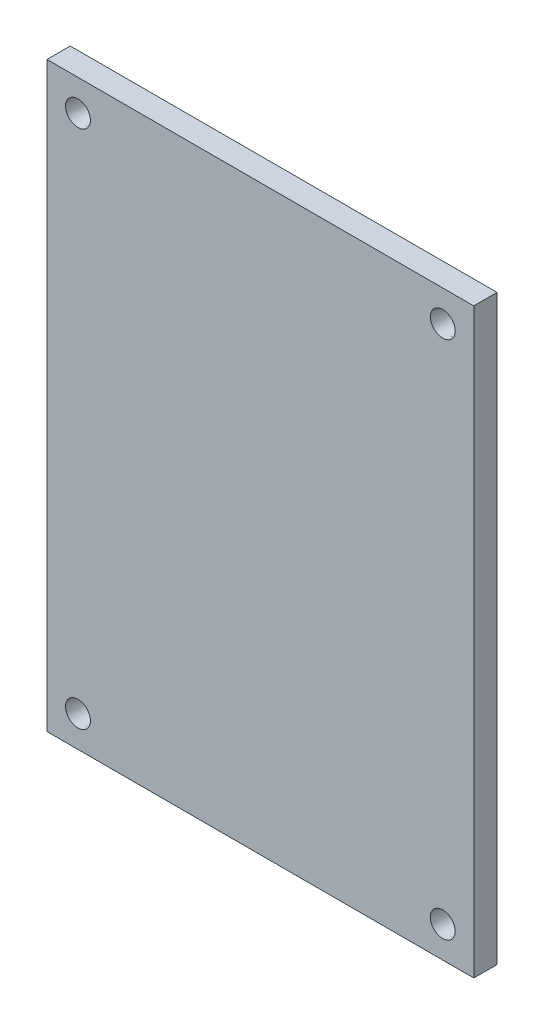
ISO-10303-21;
HEADER;
FILE_DESCRIPTION(('STEP AP214'),'2;1');
FILE_NAME('part.step','',(''),(''),'','','');
FILE_SCHEMA(('AUTOMOTIVE_DESIGN { 1 0 10303 214 1 1 1 1 }'));
ENDSEC;
DATA;
#1=APPLICATION_CONTEXT('core data for automotive mechanical design processes');
#2=APPLICATION_PROTOCOL_DEFINITION('international standard','automotive_design',2000,#1);
#3=PRODUCT_CONTEXT('',#1,'mechanical');
#4=PRODUCT('Part','Part','',(#3));
#5=PRODUCT_RELATED_PRODUCT_CATEGORY('part','',(#4));
#6=PRODUCT_DEFINITION_FORMATION('','',#4);
#7=PRODUCT_DEFINITION_CONTEXT('part definition',#1,'design');
#8=PRODUCT_DEFINITION('design','',#6,#7);
#9=PRODUCT_DEFINITION_SHAPE('','',#8);
#10=(LENGTH_UNIT() NAMED_UNIT(*) SI_UNIT(.MILLI.,.METRE.));
#11=(NAMED_UNIT(*) PLANE_ANGLE_UNIT() SI_UNIT($,.RADIAN.));
#12=(NAMED_UNIT(*) SI_UNIT($,.STERADIAN.) SOLID_ANGLE_UNIT());
#13=UNCERTAINTY_MEASURE_WITH_UNIT(LENGTH_MEASURE(1.E-05),#10,'distance_accuracy_value','');
#14=(GEOMETRIC_REPRESENTATION_CONTEXT(3) GLOBAL_UNCERTAINTY_ASSIGNED_CONTEXT((#13)) GLOBAL_UNIT_ASSIGNED_CONTEXT((#10,
#11,#12)) REPRESENTATION_CONTEXT('',''));
#15=CARTESIAN_POINT('',(0.,0.,0.));
#16=DIRECTION('',(0.,0.,1.));
#17=DIRECTION('',(1.,0.,0.));
#18=AXIS2_PLACEMENT_3D('',#15,#16,#17);
#19=CARTESIAN_POINT('',(27.5,-37.5,3.));
#20=DIRECTION('',(0.,1.,0.));
#21=DIRECTION('',(0.,0.,1.));
#22=AXIS2_PLACEMENT_3D('',#19,#20,#21);
#23=PLANE('',#22);
#24=DIRECTION('',(1.,0.,0.));
#25=VECTOR('',#24,1.);
#26=CARTESIAN_POINT('',(27.5,-37.5,0.));
#27=LINE('',#26,#25);
#28=CARTESIAN_POINT('',(-27.5,-37.5,0.));
#29=VERTEX_POINT('',#28);
#30=CARTESIAN_POINT('',(27.5,-37.5,0.));
#31=VERTEX_POINT('',#30);
#32=EDGE_CURVE('E106',#29,#31,#27,.T.);
#33=ORIENTED_EDGE('',*,*,#32,.T.);
#34=DIRECTION('',(0.,0.,-1.));
#35=VECTOR('',#34,1.);
#36=CARTESIAN_POINT('',(27.5,-37.5,3.));
#37=LINE('',#36,#35);
#38=CARTESIAN_POINT('',(27.5,-37.5,3.));
#39=VERTEX_POINT('',#38);
#40=EDGE_CURVE('E11',#39,#31,#37,.T.);
#41=ORIENTED_EDGE('',*,*,#40,.F.);
#42=DIRECTION('',(1.,0.,0.));
#43=VECTOR('',#42,1.);
#44=CARTESIAN_POINT('',(27.5,-37.5,3.));
#45=LINE('',#44,#43);
#46=CARTESIAN_POINT('',(-27.5,-37.5,3.));
#47=VERTEX_POINT('',#46);
#48=EDGE_CURVE('E94',#47,#39,#45,.T.);
#49=ORIENTED_EDGE('',*,*,#48,.F.);
#50=DIRECTION('',(0.,0.,-1.));
#51=VECTOR('',#50,1.);
#52=CARTESIAN_POINT('',(-27.5,-37.5,3.));
#53=LINE('',#52,#51);
#54=EDGE_CURVE('E105',#47,#29,#53,.T.);
#55=ORIENTED_EDGE('',*,*,#54,.T.);
#56=EDGE_LOOP('',(#33,#41,#49,#55));
#57=FACE_BOUND('',#56,.T.);
#58=ADVANCED_FACE('F43',(#57),#23,.F.);
#59=CARTESIAN_POINT('',(27.5,37.5,3.));
#60=DIRECTION('',(-1.,0.,0.));
#61=DIRECTION('',(0.,-1.,0.));
#62=AXIS2_PLACEMENT_3D('',#59,#60,#61);
#63=PLANE('',#62);
#64=DIRECTION('',(0.,1.,0.));
#65=VECTOR('',#64,1.);
#66=CARTESIAN_POINT('',(27.5,37.5,0.));
#67=LINE('',#66,#65);
#68=CARTESIAN_POINT('',(27.5,37.5,0.));
#69=VERTEX_POINT('',#68);
#70=EDGE_CURVE('E98',#31,#69,#67,.T.);
#71=ORIENTED_EDGE('',*,*,#70,.T.);
#72=DIRECTION('',(0.,0.,-1.));
#73=VECTOR('',#72,1.);
#74=CARTESIAN_POINT('',(27.5,37.5,3.));
#75=LINE('',#74,#73);
#76=CARTESIAN_POINT('',(27.5,37.5,3.));
#77=VERTEX_POINT('',#76);
#78=EDGE_CURVE('E51',#77,#69,#75,.T.);
#79=ORIENTED_EDGE('',*,*,#78,.F.);
#80=DIRECTION('',(0.,1.,0.));
#81=VECTOR('',#80,1.);
#82=CARTESIAN_POINT('',(27.5,37.5,3.));
#83=LINE('',#82,#81);
#84=EDGE_CURVE('E90',#39,#77,#83,.T.);
#85=ORIENTED_EDGE('',*,*,#84,.F.);
#86=ORIENTED_EDGE('',*,*,#40,.T.);
#87=EDGE_LOOP('',(#71,#79,#85,#86));
#88=FACE_BOUND('',#87,.T.);
#89=ADVANCED_FACE('F100',(#88),#63,.F.);
#90=CARTESIAN_POINT('',(27.5,37.5,3.));
#91=DIRECTION('',(0.,-1.,0.));
#92=DIRECTION('',(0.,0.,-1.));
#93=AXIS2_PLACEMENT_3D('',#90,#91,#92);
#94=PLANE('',#93);
#95=DIRECTION('',(-1.,0.,0.));
#96=VECTOR('',#95,1.);
#97=CARTESIAN_POINT('',(27.5,37.5,0.));
#98=LINE('',#97,#96);
#99=CARTESIAN_POINT('',(-27.5,37.5,0.));
#100=VERTEX_POINT('',#99);
#101=EDGE_CURVE('E77',#69,#100,#98,.T.);
#102=ORIENTED_EDGE('',*,*,#101,.T.);
#103=DIRECTION('',(0.,0.,-1.));
#104=VECTOR('',#103,1.);
#105=CARTESIAN_POINT('',(-27.5,37.5,3.));
#106=LINE('',#105,#104);
#107=CARTESIAN_POINT('',(-27.5,37.5,3.));
#108=VERTEX_POINT('',#107);
#109=EDGE_CURVE('E97',#108,#100,#106,.T.);
#110=ORIENTED_EDGE('',*,*,#109,.F.);
#111=DIRECTION('',(-1.,0.,0.));
#112=VECTOR('',#111,1.);
#113=CARTESIAN_POINT('',(27.5,37.5,3.));
#114=LINE('',#113,#112);
#115=EDGE_CURVE('E95',#77,#108,#114,.T.);
#116=ORIENTED_EDGE('',*,*,#115,.F.);
#117=ORIENTED_EDGE('',*,*,#78,.T.);
#118=EDGE_LOOP('',(#102,#110,#116,#117));
#119=FACE_BOUND('',#118,.T.);
#120=ADVANCED_FACE('F99',(#119),#94,.F.);
#121=CARTESIAN_POINT('',(-27.5,37.5,3.));
#122=DIRECTION('',(1.,0.,0.));
#123=DIRECTION('',(0.,1.,0.));
#124=AXIS2_PLACEMENT_3D('',#121,#122,#123);
#125=PLANE('',#124);
#126=DIRECTION('',(0.,-1.,0.));
#127=VECTOR('',#126,1.);
#128=CARTESIAN_POINT('',(-27.5,37.5,0.));
#129=LINE('',#128,#127);
#130=EDGE_CURVE('E85',#100,#29,#129,.T.);
#131=ORIENTED_EDGE('',*,*,#130,.T.);
#132=ORIENTED_EDGE('',*,*,#54,.F.);
#133=DIRECTION('',(0.,-1.,0.));
#134=VECTOR('',#133,1.);
#135=CARTESIAN_POINT('',(-27.5,37.5,3.));
#136=LINE('',#135,#134);
#137=EDGE_CURVE('E56',#108,#47,#136,.T.);
#138=ORIENTED_EDGE('',*,*,#137,.F.);
#139=ORIENTED_EDGE('',*,*,#109,.T.);
#140=EDGE_LOOP('',(#131,#132,#138,#139));
#141=FACE_BOUND('',#140,.T.);
#142=ADVANCED_FACE('F111',(#141),#125,.F.);
#143=CARTESIAN_POINT('',(0.,0.,3.));
#144=DIRECTION('',(0.,0.,1.));
#145=DIRECTION('',(1.,0.,0.));
#146=AXIS2_PLACEMENT_3D('',#143,#144,#145);
#147=PLANE('',#146);
#148=CARTESIAN_POINT('',(23.5,33.5,3.));
#149=DIRECTION('',(0.,0.,1.));
#150=DIRECTION('',(1.,0.,0.));
#151=AXIS2_PLACEMENT_3D('',#148,#149,#150);
#152=CIRCLE('',#151,1.6);
#153=CARTESIAN_POINT('',(25.1,33.5,3.));
#154=VERTEX_POINT('',#153);
#155=EDGE_CURVE('E127',#154,#154,#152,.T.);
#156=ORIENTED_EDGE('',*,*,#155,.F.);
#157=EDGE_LOOP('',(#156));
#158=FACE_BOUND('',#157,.T.);
#159=CARTESIAN_POINT('',(-23.5,33.5,3.));
#160=DIRECTION('',(0.,0.,1.));
#161=DIRECTION('',(1.,0.,0.));
#162=AXIS2_PLACEMENT_3D('',#159,#160,#161);
#163=CIRCLE('',#162,1.6);
#164=CARTESIAN_POINT('',(-21.9,33.5,3.));
#165=VERTEX_POINT('',#164);
#166=EDGE_CURVE('E134',#165,#165,#163,.T.);
#167=ORIENTED_EDGE('',*,*,#166,.F.);
#168=EDGE_LOOP('',(#167));
#169=FACE_BOUND('',#168,.T.);
#170=CARTESIAN_POINT('',(-23.5,-33.5,3.));
#171=DIRECTION('',(0.,0.,1.));
#172=DIRECTION('',(1.,0.,0.));
#173=AXIS2_PLACEMENT_3D('',#170,#171,#172);
#174=CIRCLE('',#173,1.6);
#175=CARTESIAN_POINT('',(-21.9,-33.5,3.));
#176=VERTEX_POINT('',#175);
#177=EDGE_CURVE('E124',#176,#176,#174,.T.);
#178=ORIENTED_EDGE('',*,*,#177,.F.);
#179=EDGE_LOOP('',(#178));
#180=FACE_BOUND('',#179,.T.);
#181=CARTESIAN_POINT('',(23.5,-33.5,3.));
#182=DIRECTION('',(0.,0.,1.));
#183=DIRECTION('',(1.,0.,0.));
#184=AXIS2_PLACEMENT_3D('',#181,#182,#183);
#185=CIRCLE('',#184,1.6);
#186=CARTESIAN_POINT('',(25.1,-33.5,3.));
#187=VERTEX_POINT('',#186);
#188=EDGE_CURVE('E125',#187,#187,#185,.T.);
#189=ORIENTED_EDGE('',*,*,#188,.F.);
#190=EDGE_LOOP('',(#189));
#191=FACE_BOUND('',#190,.T.);
#192=ORIENTED_EDGE('',*,*,#48,.T.);
#193=ORIENTED_EDGE('',*,*,#84,.T.);
#194=ORIENTED_EDGE('',*,*,#115,.T.);
#195=ORIENTED_EDGE('',*,*,#137,.T.);
#196=EDGE_LOOP('',(#192,#193,#194,#195));
#197=FACE_BOUND('',#196,.T.);
#198=ADVANCED_FACE('F89',(#158,#169,#180,#191,#197),#147,.T.);
#199=CARTESIAN_POINT('',(0.,0.,0.));
#200=DIRECTION('',(0.,0.,1.));
#201=DIRECTION('',(1.,0.,0.));
#202=AXIS2_PLACEMENT_3D('',#199,#200,#201);
#203=PLANE('',#202);
#204=CARTESIAN_POINT('',(23.5,33.5,0.));
#205=DIRECTION('',(0.,0.,1.));
#206=DIRECTION('',(1.,0.,0.));
#207=AXIS2_PLACEMENT_3D('',#204,#205,#206);
#208=CIRCLE('',#207,1.33753400942223);
#209=CARTESIAN_POINT('',(24.8375340094222,33.5,0.));
#210=VERTEX_POINT('',#209);
#211=EDGE_CURVE('E128',#210,#210,#208,.T.);
#212=ORIENTED_EDGE('',*,*,#211,.T.);
#213=EDGE_LOOP('',(#212));
#214=FACE_BOUND('',#213,.T.);
#215=CARTESIAN_POINT('',(-23.5,33.5,0.));
#216=DIRECTION('',(0.,0.,1.));
#217=DIRECTION('',(1.,0.,0.));
#218=AXIS2_PLACEMENT_3D('',#215,#216,#217);
#219=CIRCLE('',#218,1.33753400942223);
#220=CARTESIAN_POINT('',(-22.1624659905778,33.5,0.));
#221=VERTEX_POINT('',#220);
#222=EDGE_CURVE('E129',#221,#221,#219,.T.);
#223=ORIENTED_EDGE('',*,*,#222,.T.);
#224=EDGE_LOOP('',(#223));
#225=FACE_BOUND('',#224,.T.);
#226=CARTESIAN_POINT('',(-23.5,-33.5,0.));
#227=DIRECTION('',(0.,0.,1.));
#228=DIRECTION('',(1.,0.,0.));
#229=AXIS2_PLACEMENT_3D('',#226,#227,#228);
#230=CIRCLE('',#229,1.33753400942223);
#231=CARTESIAN_POINT('',(-22.1624659905778,-33.5,0.));
#232=VERTEX_POINT('',#231);
#233=EDGE_CURVE('E136',#232,#232,#230,.T.);
#234=ORIENTED_EDGE('',*,*,#233,.T.);
#235=EDGE_LOOP('',(#234));
#236=FACE_BOUND('',#235,.T.);
#237=CARTESIAN_POINT('',(23.5,-33.5,0.));
#238=DIRECTION('',(0.,0.,1.));
#239=DIRECTION('',(1.,0.,0.));
#240=AXIS2_PLACEMENT_3D('',#237,#238,#239);
#241=CIRCLE('',#240,1.33753400942223);
#242=CARTESIAN_POINT('',(24.8375340094222,-33.5,0.));
#243=VERTEX_POINT('',#242);
#244=EDGE_CURVE('E108',#243,#243,#241,.T.);
#245=ORIENTED_EDGE('',*,*,#244,.T.);
#246=EDGE_LOOP('',(#245));
#247=FACE_BOUND('',#246,.T.);
#248=ORIENTED_EDGE('',*,*,#32,.F.);
#249=ORIENTED_EDGE('',*,*,#130,.F.);
#250=ORIENTED_EDGE('',*,*,#101,.F.);
#251=ORIENTED_EDGE('',*,*,#70,.F.);
#252=EDGE_LOOP('',(#248,#249,#250,#251));
#253=FACE_BOUND('',#252,.T.);
#254=ADVANCED_FACE('F120',(#214,#225,#236,#247,#253),#203,.F.);
#255=CARTESIAN_POINT('',(23.5,-33.5,3.));
#256=DIRECTION('',(0.,0.,1.));
#257=DIRECTION('',(1.,0.,0.));
#258=AXIS2_PLACEMENT_3D('',#255,#256,#257);
#259=CONICAL_SURFACE('',#258,1.6,0.0872664625997165);
#260=ORIENTED_EDGE('',*,*,#244,.F.);
#261=EDGE_LOOP('',(#260));
#262=FACE_BOUND('',#261,.T.);
#263=ORIENTED_EDGE('',*,*,#188,.T.);
#264=EDGE_LOOP('',(#263));
#265=FACE_BOUND('',#264,.T.);
#266=ADVANCED_FACE('F147',(#262,#265),#259,.F.);
#267=CARTESIAN_POINT('',(-23.5,-33.5,3.));
#268=DIRECTION('',(0.,0.,1.));
#269=DIRECTION('',(1.,0.,0.));
#270=AXIS2_PLACEMENT_3D('',#267,#268,#269);
#271=CONICAL_SURFACE('',#270,1.6,0.0872664625997165);
#272=ORIENTED_EDGE('',*,*,#233,.F.);
#273=EDGE_LOOP('',(#272));
#274=FACE_BOUND('',#273,.T.);
#275=ORIENTED_EDGE('',*,*,#177,.T.);
#276=EDGE_LOOP('',(#275));
#277=FACE_BOUND('',#276,.T.);
#278=ADVANCED_FACE('F148',(#274,#277),#271,.F.);
#279=CARTESIAN_POINT('',(-23.5,33.5,3.));
#280=DIRECTION('',(0.,0.,1.));
#281=DIRECTION('',(1.,0.,0.));
#282=AXIS2_PLACEMENT_3D('',#279,#280,#281);
#283=CONICAL_SURFACE('',#282,1.6,0.0872664625997165);
#284=ORIENTED_EDGE('',*,*,#222,.F.);
#285=EDGE_LOOP('',(#284));
#286=FACE_BOUND('',#285,.T.);
#287=ORIENTED_EDGE('',*,*,#166,.T.);
#288=EDGE_LOOP('',(#287));
#289=FACE_BOUND('',#288,.T.);
#290=ADVANCED_FACE('F149',(#286,#289),#283,.F.);
#291=CARTESIAN_POINT('',(23.5,33.5,3.));
#292=DIRECTION('',(0.,0.,1.));
#293=DIRECTION('',(1.,0.,0.));
#294=AXIS2_PLACEMENT_3D('',#291,#292,#293);
#295=CONICAL_SURFACE('',#294,1.6,0.0872664625997165);
#296=ORIENTED_EDGE('',*,*,#211,.F.);
#297=EDGE_LOOP('',(#296));
#298=FACE_BOUND('',#297,.T.);
#299=ORIENTED_EDGE('',*,*,#155,.T.);
#300=EDGE_LOOP('',(#299));
#301=FACE_BOUND('',#300,.T.);
#302=ADVANCED_FACE('F212',(#298,#301),#295,.F.);
#303=CLOSED_SHELL('',(#58,#89,#120,#142,#198,#254,#266,#278,#290,#302));
#304=MANIFOLD_SOLID_BREP('B2',#303);
#305=ADVANCED_BREP_SHAPE_REPRESENTATION('',(#18,#304),#14);
#306=SHAPE_DEFINITION_REPRESENTATION(#9,#305);
ENDSEC;
END-ISO-10303-21;
